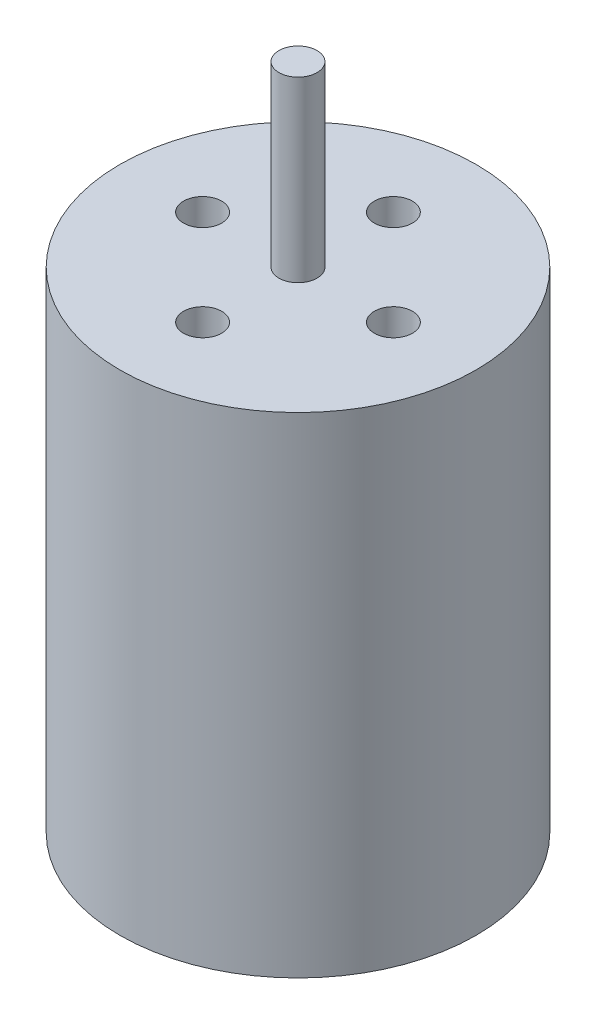
ISO-10303-21;
HEADER;
FILE_DESCRIPTION(('STEP AP214'),'2;1');
FILE_NAME('part.step','',(''),(''),'','','');
FILE_SCHEMA(('AUTOMOTIVE_DESIGN { 1 0 10303 214 1 1 1 1 }'));
ENDSEC;
DATA;
#1=APPLICATION_CONTEXT('core data for automotive mechanical design processes');
#2=APPLICATION_PROTOCOL_DEFINITION('international standard','automotive_design',2000,#1);
#3=PRODUCT_CONTEXT('',#1,'mechanical');
#4=PRODUCT('Part','Part','',(#3));
#5=PRODUCT_RELATED_PRODUCT_CATEGORY('part','',(#4));
#6=PRODUCT_DEFINITION_FORMATION('','',#4);
#7=PRODUCT_DEFINITION_CONTEXT('part definition',#1,'design');
#8=PRODUCT_DEFINITION('design','',#6,#7);
#9=PRODUCT_DEFINITION_SHAPE('','',#8);
#10=(LENGTH_UNIT() NAMED_UNIT(*) SI_UNIT(.MILLI.,.METRE.));
#11=(NAMED_UNIT(*) PLANE_ANGLE_UNIT() SI_UNIT($,.RADIAN.));
#12=(NAMED_UNIT(*) SI_UNIT($,.STERADIAN.) SOLID_ANGLE_UNIT());
#13=UNCERTAINTY_MEASURE_WITH_UNIT(LENGTH_MEASURE(1.E-05),#10,'distance_accuracy_value','');
#14=(GEOMETRIC_REPRESENTATION_CONTEXT(3) GLOBAL_UNCERTAINTY_ASSIGNED_CONTEXT((#13)) GLOBAL_UNIT_ASSIGNED_CONTEXT((#10,
#11,#12)) REPRESENTATION_CONTEXT('',''));
#15=CARTESIAN_POINT('',(0.,0.,0.));
#16=DIRECTION('',(0.,0.,1.));
#17=DIRECTION('',(1.,0.,0.));
#18=AXIS2_PLACEMENT_3D('',#15,#16,#17);
#19=CARTESIAN_POINT('',(0.,-27.5,0.));
#20=DIRECTION('',(0.,-1.,0.));
#21=DIRECTION('',(0.,0.,-1.));
#22=AXIS2_PLACEMENT_3D('',#19,#20,#21);
#23=PLANE('',#22);
#24=CARTESIAN_POINT('',(0.,-27.5,0.));
#25=DIRECTION('',(0.,-1.,0.));
#26=DIRECTION('',(0.,0.,-1.));
#27=AXIS2_PLACEMENT_3D('',#24,#25,#26);
#28=CIRCLE('',#27,4.4);
#29=CARTESIAN_POINT('',(0.,-27.5,-4.4));
#30=VERTEX_POINT('',#29);
#31=EDGE_CURVE('E10',#30,#30,#28,.T.);
#32=ORIENTED_EDGE('',*,*,#31,.T.);
#33=EDGE_LOOP('',(#32));
#34=FACE_BOUND('',#33,.T.);
#35=ADVANCED_FACE('F36',(#34),#23,.T.);
#36=CARTESIAN_POINT('',(0.,-23.4674134419485,0.));
#37=DIRECTION('',(0.,-1.,0.));
#38=DIRECTION('',(0.,0.,-1.));
#39=AXIS2_PLACEMENT_3D('',#36,#37,#38);
#40=CYLINDRICAL_SURFACE('',#39,4.4);
#41=CARTESIAN_POINT('',(0.,-25.,0.));
#42=DIRECTION('',(0.,-1.,0.));
#43=DIRECTION('',(0.,0.,-1.));
#44=AXIS2_PLACEMENT_3D('',#41,#42,#43);
#45=CIRCLE('',#44,4.4);
#46=CARTESIAN_POINT('',(0.,-25.,-4.4));
#47=VERTEX_POINT('',#46);
#48=EDGE_CURVE('E43',#47,#47,#45,.T.);
#49=ORIENTED_EDGE('',*,*,#48,.T.);
#50=EDGE_LOOP('',(#49));
#51=FACE_BOUND('',#50,.T.);
#52=ORIENTED_EDGE('',*,*,#31,.F.);
#53=EDGE_LOOP('',(#52));
#54=FACE_BOUND('',#53,.T.);
#55=ADVANCED_FACE('F133',(#51,#54),#40,.T.);
#56=CARTESIAN_POINT('',(4.4,-25.,0.));
#57=DIRECTION('',(0.,-1.,0.));
#58=DIRECTION('',(0.,0.,-1.));
#59=AXIS2_PLACEMENT_3D('',#56,#57,#58);
#60=PLANE('',#59);
#61=CARTESIAN_POINT('',(0.,-25.,0.));
#62=DIRECTION('',(0.,-1.,0.));
#63=DIRECTION('',(0.,0.,-1.));
#64=AXIS2_PLACEMENT_3D('',#61,#62,#63);
#65=CIRCLE('',#64,14.);
#66=CARTESIAN_POINT('',(0.,-25.,-14.));
#67=VERTEX_POINT('',#66);
#68=EDGE_CURVE('E48',#67,#67,#65,.T.);
#69=ORIENTED_EDGE('',*,*,#68,.T.);
#70=EDGE_LOOP('',(#69));
#71=FACE_BOUND('',#70,.T.);
#72=ORIENTED_EDGE('',*,*,#48,.F.);
#73=EDGE_LOOP('',(#72));
#74=FACE_BOUND('',#73,.T.);
#75=ADVANCED_FACE('F127',(#71,#74),#60,.T.);
#76=CARTESIAN_POINT('',(0.,-23.4674134419485,0.));
#77=DIRECTION('',(0.,-1.,0.));
#78=DIRECTION('',(0.,0.,-1.));
#79=AXIS2_PLACEMENT_3D('',#76,#77,#78);
#80=CYLINDRICAL_SURFACE('',#79,14.);
#81=CARTESIAN_POINT('',(0.,13.5,0.));
#82=DIRECTION('',(0.,-1.,0.));
#83=DIRECTION('',(0.,0.,-1.));
#84=AXIS2_PLACEMENT_3D('',#81,#82,#83);
#85=CIRCLE('',#84,14.);
#86=CARTESIAN_POINT('',(0.,13.5,-14.));
#87=VERTEX_POINT('',#86);
#88=EDGE_CURVE('E53',#87,#87,#85,.T.);
#89=ORIENTED_EDGE('',*,*,#88,.T.);
#90=EDGE_LOOP('',(#89));
#91=FACE_BOUND('',#90,.T.);
#92=ORIENTED_EDGE('',*,*,#68,.F.);
#93=EDGE_LOOP('',(#92));
#94=FACE_BOUND('',#93,.T.);
#95=ADVANCED_FACE('F113',(#91,#94),#80,.T.);
#96=CARTESIAN_POINT('',(14.,13.5,0.));
#97=DIRECTION('',(0.,1.,0.));
#98=DIRECTION('',(0.,0.,1.));
#99=AXIS2_PLACEMENT_3D('',#96,#97,#98);
#100=PLANE('',#99);
#101=CARTESIAN_POINT('',(-7.5,13.5,0.));
#102=DIRECTION('',(0.,1.,0.));
#103=DIRECTION('',(0.,0.,1.));
#104=AXIS2_PLACEMENT_3D('',#101,#102,#103);
#105=CIRCLE('',#104,1.5);
#106=CARTESIAN_POINT('',(-7.5,13.5,1.5));
#107=VERTEX_POINT('',#106);
#108=EDGE_CURVE('E92',#107,#107,#105,.T.);
#109=ORIENTED_EDGE('',*,*,#108,.F.);
#110=EDGE_LOOP('',(#109));
#111=FACE_BOUND('',#110,.T.);
#112=CARTESIAN_POINT('',(0.,13.5,7.5));
#113=DIRECTION('',(0.,1.,0.));
#114=DIRECTION('',(0.,0.,1.));
#115=AXIS2_PLACEMENT_3D('',#112,#113,#114);
#116=CIRCLE('',#115,1.5);
#117=CARTESIAN_POINT('',(0.,13.5,9.));
#118=VERTEX_POINT('',#117);
#119=EDGE_CURVE('E84',#118,#118,#116,.T.);
#120=ORIENTED_EDGE('',*,*,#119,.F.);
#121=EDGE_LOOP('',(#120));
#122=FACE_BOUND('',#121,.T.);
#123=CARTESIAN_POINT('',(7.5,13.5,0.));
#124=DIRECTION('',(0.,1.,0.));
#125=DIRECTION('',(0.,0.,1.));
#126=AXIS2_PLACEMENT_3D('',#123,#124,#125);
#127=CIRCLE('',#126,1.5);
#128=CARTESIAN_POINT('',(7.5,13.5,1.5));
#129=VERTEX_POINT('',#128);
#130=EDGE_CURVE('E76',#129,#129,#127,.T.);
#131=ORIENTED_EDGE('',*,*,#130,.F.);
#132=EDGE_LOOP('',(#131));
#133=FACE_BOUND('',#132,.T.);
#134=CARTESIAN_POINT('',(0.,13.5,-7.5));
#135=DIRECTION('',(0.,1.,0.));
#136=DIRECTION('',(0.,0.,1.));
#137=AXIS2_PLACEMENT_3D('',#134,#135,#136);
#138=CIRCLE('',#137,1.5);
#139=CARTESIAN_POINT('',(0.,13.5,-6.));
#140=VERTEX_POINT('',#139);
#141=EDGE_CURVE('E68',#140,#140,#138,.T.);
#142=ORIENTED_EDGE('',*,*,#141,.F.);
#143=EDGE_LOOP('',(#142));
#144=FACE_BOUND('',#143,.T.);
#145=CARTESIAN_POINT('',(0.,13.5,0.));
#146=DIRECTION('',(0.,-1.,0.));
#147=DIRECTION('',(0.,0.,-1.));
#148=AXIS2_PLACEMENT_3D('',#145,#146,#147);
#149=CIRCLE('',#148,1.5);
#150=CARTESIAN_POINT('',(0.,13.5,-1.5));
#151=VERTEX_POINT('',#150);
#152=EDGE_CURVE('E59',#151,#151,#149,.T.);
#153=ORIENTED_EDGE('',*,*,#152,.T.);
#154=EDGE_LOOP('',(#153));
#155=FACE_BOUND('',#154,.T.);
#156=ORIENTED_EDGE('',*,*,#88,.F.);
#157=EDGE_LOOP('',(#156));
#158=FACE_BOUND('',#157,.T.);
#159=ADVANCED_FACE('F109',(#111,#122,#133,#144,#155,#158),#100,.T.);
#160=CARTESIAN_POINT('',(0.,-23.4674134419485,0.));
#161=DIRECTION('',(0.,-1.,0.));
#162=DIRECTION('',(0.,0.,-1.));
#163=AXIS2_PLACEMENT_3D('',#160,#161,#162);
#164=CYLINDRICAL_SURFACE('',#163,1.5);
#165=CARTESIAN_POINT('',(0.,27.5,0.));
#166=DIRECTION('',(0.,-1.,0.));
#167=DIRECTION('',(0.,0.,-1.));
#168=AXIS2_PLACEMENT_3D('',#165,#166,#167);
#169=CIRCLE('',#168,1.5);
#170=CARTESIAN_POINT('',(0.,27.5,-1.5));
#171=VERTEX_POINT('',#170);
#172=EDGE_CURVE('E63',#171,#171,#169,.T.);
#173=ORIENTED_EDGE('',*,*,#172,.T.);
#174=EDGE_LOOP('',(#173));
#175=FACE_BOUND('',#174,.T.);
#176=ORIENTED_EDGE('',*,*,#152,.F.);
#177=EDGE_LOOP('',(#176));
#178=FACE_BOUND('',#177,.T.);
#179=ADVANCED_FACE('F112',(#175,#178),#164,.T.);
#180=CARTESIAN_POINT('',(1.5,27.5,0.));
#181=DIRECTION('',(0.,1.,0.));
#182=DIRECTION('',(0.,0.,1.));
#183=AXIS2_PLACEMENT_3D('',#180,#181,#182);
#184=PLANE('',#183);
#185=ORIENTED_EDGE('',*,*,#172,.F.);
#186=EDGE_LOOP('',(#185));
#187=FACE_BOUND('',#186,.T.);
#188=ADVANCED_FACE('F166',(#187),#184,.T.);
#189=CARTESIAN_POINT('',(0.,10.5,-7.5));
#190=DIRECTION('',(0.,1.,0.));
#191=DIRECTION('',(0.,0.,1.));
#192=AXIS2_PLACEMENT_3D('',#189,#190,#191);
#193=CYLINDRICAL_SURFACE('',#192,1.5);
#194=CARTESIAN_POINT('',(0.,10.5,-7.5));
#195=DIRECTION('',(0.,1.,0.));
#196=DIRECTION('',(0.,0.,1.));
#197=AXIS2_PLACEMENT_3D('',#194,#195,#196);
#198=CIRCLE('',#197,1.5);
#199=CARTESIAN_POINT('',(0.,10.5,-6.));
#200=VERTEX_POINT('',#199);
#201=EDGE_CURVE('E72',#200,#200,#198,.T.);
#202=ORIENTED_EDGE('',*,*,#201,.F.);
#203=EDGE_LOOP('',(#202));
#204=FACE_BOUND('',#203,.T.);
#205=ORIENTED_EDGE('',*,*,#141,.T.);
#206=EDGE_LOOP('',(#205));
#207=FACE_BOUND('',#206,.T.);
#208=ADVANCED_FACE('F175',(#204,#207),#193,.F.);
#209=CARTESIAN_POINT('',(0.,10.5,-7.5));
#210=DIRECTION('',(0.,1.,0.));
#211=DIRECTION('',(0.,0.,1.));
#212=AXIS2_PLACEMENT_3D('',#209,#210,#211);
#213=PLANE('',#212);
#214=ORIENTED_EDGE('',*,*,#201,.T.);
#215=EDGE_LOOP('',(#214));
#216=FACE_BOUND('',#215,.T.);
#217=ADVANCED_FACE('F188',(#216),#213,.T.);
#218=CARTESIAN_POINT('',(7.5,10.5,0.));
#219=DIRECTION('',(0.,1.,0.));
#220=DIRECTION('',(0.,0.,1.));
#221=AXIS2_PLACEMENT_3D('',#218,#219,#220);
#222=CYLINDRICAL_SURFACE('',#221,1.5);
#223=CARTESIAN_POINT('',(7.5,10.5,0.));
#224=DIRECTION('',(0.,1.,0.));
#225=DIRECTION('',(0.,0.,1.));
#226=AXIS2_PLACEMENT_3D('',#223,#224,#225);
#227=CIRCLE('',#226,1.5);
#228=CARTESIAN_POINT('',(7.5,10.5,1.5));
#229=VERTEX_POINT('',#228);
#230=EDGE_CURVE('E80',#229,#229,#227,.T.);
#231=ORIENTED_EDGE('',*,*,#230,.F.);
#232=EDGE_LOOP('',(#231));
#233=FACE_BOUND('',#232,.T.);
#234=ORIENTED_EDGE('',*,*,#130,.T.);
#235=EDGE_LOOP('',(#234));
#236=FACE_BOUND('',#235,.T.);
#237=ADVANCED_FACE('F198',(#233,#236),#222,.F.);
#238=CARTESIAN_POINT('',(7.5,10.5,0.));
#239=DIRECTION('',(0.,1.,0.));
#240=DIRECTION('',(0.,0.,1.));
#241=AXIS2_PLACEMENT_3D('',#238,#239,#240);
#242=PLANE('',#241);
#243=ORIENTED_EDGE('',*,*,#230,.T.);
#244=EDGE_LOOP('',(#243));
#245=FACE_BOUND('',#244,.T.);
#246=ADVANCED_FACE('F208',(#245),#242,.T.);
#247=CARTESIAN_POINT('',(0.,10.5,7.5));
#248=DIRECTION('',(0.,1.,0.));
#249=DIRECTION('',(0.,0.,1.));
#250=AXIS2_PLACEMENT_3D('',#247,#248,#249);
#251=CYLINDRICAL_SURFACE('',#250,1.5);
#252=CARTESIAN_POINT('',(0.,10.5,7.5));
#253=DIRECTION('',(0.,1.,0.));
#254=DIRECTION('',(0.,0.,1.));
#255=AXIS2_PLACEMENT_3D('',#252,#253,#254);
#256=CIRCLE('',#255,1.5);
#257=CARTESIAN_POINT('',(0.,10.5,9.));
#258=VERTEX_POINT('',#257);
#259=EDGE_CURVE('E88',#258,#258,#256,.T.);
#260=ORIENTED_EDGE('',*,*,#259,.F.);
#261=EDGE_LOOP('',(#260));
#262=FACE_BOUND('',#261,.T.);
#263=ORIENTED_EDGE('',*,*,#119,.T.);
#264=EDGE_LOOP('',(#263));
#265=FACE_BOUND('',#264,.T.);
#266=ADVANCED_FACE('F218',(#262,#265),#251,.F.);
#267=CARTESIAN_POINT('',(0.,10.5,7.5));
#268=DIRECTION('',(0.,1.,0.));
#269=DIRECTION('',(0.,0.,1.));
#270=AXIS2_PLACEMENT_3D('',#267,#268,#269);
#271=PLANE('',#270);
#272=ORIENTED_EDGE('',*,*,#259,.T.);
#273=EDGE_LOOP('',(#272));
#274=FACE_BOUND('',#273,.T.);
#275=ADVANCED_FACE('F105',(#274),#271,.T.);
#276=CARTESIAN_POINT('',(-7.5,10.5,0.));
#277=DIRECTION('',(0.,1.,0.));
#278=DIRECTION('',(0.,0.,1.));
#279=AXIS2_PLACEMENT_3D('',#276,#277,#278);
#280=CYLINDRICAL_SURFACE('',#279,1.5);
#281=CARTESIAN_POINT('',(-7.5,10.5,0.));
#282=DIRECTION('',(0.,1.,0.));
#283=DIRECTION('',(0.,0.,1.));
#284=AXIS2_PLACEMENT_3D('',#281,#282,#283);
#285=CIRCLE('',#284,1.5);
#286=CARTESIAN_POINT('',(-7.5,10.5,1.5));
#287=VERTEX_POINT('',#286);
#288=EDGE_CURVE('E67',#287,#287,#285,.T.);
#289=ORIENTED_EDGE('',*,*,#288,.F.);
#290=EDGE_LOOP('',(#289));
#291=FACE_BOUND('',#290,.T.);
#292=ORIENTED_EDGE('',*,*,#108,.T.);
#293=EDGE_LOOP('',(#292));
#294=FACE_BOUND('',#293,.T.);
#295=ADVANCED_FACE('F102',(#291,#294),#280,.F.);
#296=CARTESIAN_POINT('',(-7.5,10.5,0.));
#297=DIRECTION('',(0.,1.,0.));
#298=DIRECTION('',(0.,0.,1.));
#299=AXIS2_PLACEMENT_3D('',#296,#297,#298);
#300=PLANE('',#299);
#301=ORIENTED_EDGE('',*,*,#288,.T.);
#302=EDGE_LOOP('',(#301));
#303=FACE_BOUND('',#302,.T.);
#304=ADVANCED_FACE('F100',(#303),#300,.T.);
#305=CLOSED_SHELL('',(#35,#55,#75,#95,#159,#179,#188,#208,#217,#237,#246,#266,#275,#295,#304));
#306=MANIFOLD_SOLID_BREP('B2',#305);
#307=ADVANCED_BREP_SHAPE_REPRESENTATION('',(#18,#306),#14);
#308=SHAPE_DEFINITION_REPRESENTATION(#9,#307);
ENDSEC;
END-ISO-10303-21;
